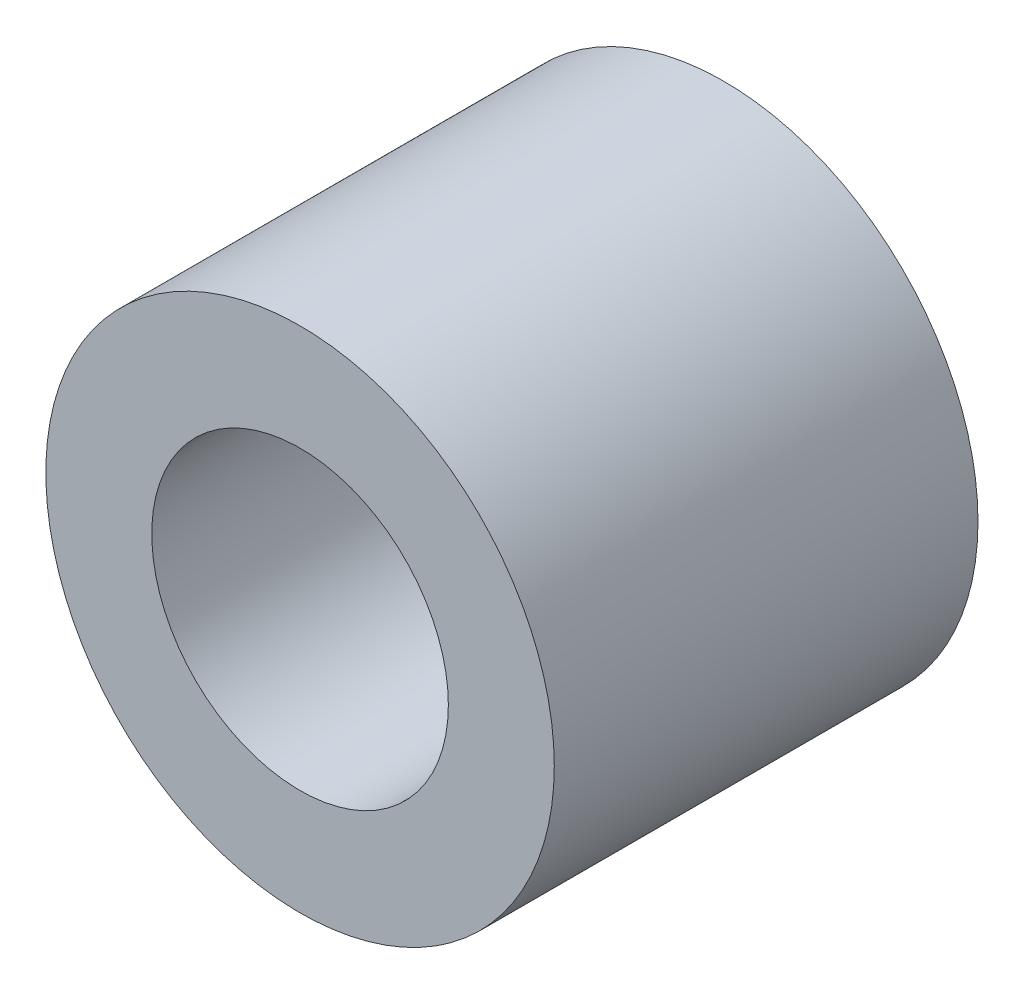
ISO-10303-21;
HEADER;
FILE_DESCRIPTION(('STEP AP214'),'2;1');
FILE_NAME('part.step','',(''),(''),'','','');
FILE_SCHEMA(('AUTOMOTIVE_DESIGN { 1 0 10303 214 1 1 1 1 }'));
ENDSEC;
DATA;
#1=APPLICATION_CONTEXT('core data for automotive mechanical design processes');
#2=APPLICATION_PROTOCOL_DEFINITION('international standard','automotive_design',2000,#1);
#3=PRODUCT_CONTEXT('',#1,'mechanical');
#4=PRODUCT('Part','Part','',(#3));
#5=PRODUCT_RELATED_PRODUCT_CATEGORY('part','',(#4));
#6=PRODUCT_DEFINITION_FORMATION('','',#4);
#7=PRODUCT_DEFINITION_CONTEXT('part definition',#1,'design');
#8=PRODUCT_DEFINITION('design','',#6,#7);
#9=PRODUCT_DEFINITION_SHAPE('','',#8);
#10=(LENGTH_UNIT() NAMED_UNIT(*) SI_UNIT(.MILLI.,.METRE.));
#11=(NAMED_UNIT(*) PLANE_ANGLE_UNIT() SI_UNIT($,.RADIAN.));
#12=(NAMED_UNIT(*) SI_UNIT($,.STERADIAN.) SOLID_ANGLE_UNIT());
#13=UNCERTAINTY_MEASURE_WITH_UNIT(LENGTH_MEASURE(1.E-05),#10,'distance_accuracy_value','');
#14=(GEOMETRIC_REPRESENTATION_CONTEXT(3) GLOBAL_UNCERTAINTY_ASSIGNED_CONTEXT((#13)) GLOBAL_UNIT_ASSIGNED_CONTEXT((#10,
#11,#12)) REPRESENTATION_CONTEXT('',''));
#15=CARTESIAN_POINT('',(0.,0.,0.));
#16=DIRECTION('',(0.,0.,1.));
#17=DIRECTION('',(1.,0.,0.));
#18=AXIS2_PLACEMENT_3D('',#15,#16,#17);
#19=CARTESIAN_POINT('',(0.,0.,10.));
#20=DIRECTION('',(0.,0.,1.));
#21=DIRECTION('',(1.,0.,0.));
#22=AXIS2_PLACEMENT_3D('',#19,#20,#21);
#23=PLANE('',#22);
#24=CARTESIAN_POINT('',(0.,0.,10.));
#25=DIRECTION('',(0.,0.,1.));
#26=DIRECTION('',(1.,0.,0.));
#27=AXIS2_PLACEMENT_3D('',#24,#25,#26);
#28=CIRCLE('',#27,6.);
#29=CARTESIAN_POINT('',(6.,0.,10.));
#30=VERTEX_POINT('',#29);
#31=EDGE_CURVE('E10',#30,#30,#28,.T.);
#32=ORIENTED_EDGE('',*,*,#31,.T.);
#33=EDGE_LOOP('',(#32));
#34=FACE_BOUND('',#33,.T.);
#35=CARTESIAN_POINT('',(0.,0.,10.));
#36=DIRECTION('',(0.,0.,1.));
#37=DIRECTION('',(1.,0.,0.));
#38=AXIS2_PLACEMENT_3D('',#35,#36,#37);
#39=CIRCLE('',#38,3.5);
#40=CARTESIAN_POINT('',(3.5,0.,10.));
#41=VERTEX_POINT('',#40);
#42=EDGE_CURVE('E45',#41,#41,#39,.T.);
#43=ORIENTED_EDGE('',*,*,#42,.F.);
#44=EDGE_LOOP('',(#43));
#45=FACE_BOUND('',#44,.T.);
#46=ADVANCED_FACE('F34',(#34,#45),#23,.T.);
#47=CARTESIAN_POINT('',(0.,0.,0.));
#48=DIRECTION('',(0.,0.,1.));
#49=DIRECTION('',(1.,0.,0.));
#50=AXIS2_PLACEMENT_3D('',#47,#48,#49);
#51=PLANE('',#50);
#52=CARTESIAN_POINT('',(0.,0.,0.));
#53=DIRECTION('',(0.,0.,1.));
#54=DIRECTION('',(1.,0.,0.));
#55=AXIS2_PLACEMENT_3D('',#52,#53,#54);
#56=CIRCLE('',#55,6.);
#57=CARTESIAN_POINT('',(6.,0.,0.));
#58=VERTEX_POINT('',#57);
#59=EDGE_CURVE('E38',#58,#58,#56,.T.);
#60=ORIENTED_EDGE('',*,*,#59,.F.);
#61=EDGE_LOOP('',(#60));
#62=FACE_BOUND('',#61,.T.);
#63=CARTESIAN_POINT('',(0.,0.,0.));
#64=DIRECTION('',(0.,0.,1.));
#65=DIRECTION('',(1.,0.,0.));
#66=AXIS2_PLACEMENT_3D('',#63,#64,#65);
#67=CIRCLE('',#66,3.5);
#68=CARTESIAN_POINT('',(3.5,0.,0.));
#69=VERTEX_POINT('',#68);
#70=EDGE_CURVE('E47',#69,#69,#67,.T.);
#71=ORIENTED_EDGE('',*,*,#70,.T.);
#72=EDGE_LOOP('',(#71));
#73=FACE_BOUND('',#72,.T.);
#74=ADVANCED_FACE('F57',(#62,#73),#51,.F.);
#75=CARTESIAN_POINT('',(0.,0.,10.));
#76=DIRECTION('',(0.,0.,-1.));
#77=DIRECTION('',(-1.,0.,0.));
#78=AXIS2_PLACEMENT_3D('',#75,#76,#77);
#79=CYLINDRICAL_SURFACE('',#78,6.);
#80=ORIENTED_EDGE('',*,*,#31,.F.);
#81=EDGE_LOOP('',(#80));
#82=FACE_BOUND('',#81,.T.);
#83=ORIENTED_EDGE('',*,*,#59,.T.);
#84=EDGE_LOOP('',(#83));
#85=FACE_BOUND('',#84,.T.);
#86=ADVANCED_FACE('F36',(#82,#85),#79,.T.);
#87=CARTESIAN_POINT('',(0.,0.,10.));
#88=DIRECTION('',(0.,0.,-1.));
#89=DIRECTION('',(-1.,0.,0.));
#90=AXIS2_PLACEMENT_3D('',#87,#88,#89);
#91=CYLINDRICAL_SURFACE('',#90,3.5);
#92=ORIENTED_EDGE('',*,*,#42,.T.);
#93=EDGE_LOOP('',(#92));
#94=FACE_BOUND('',#93,.T.);
#95=ORIENTED_EDGE('',*,*,#70,.F.);
#96=EDGE_LOOP('',(#95));
#97=FACE_BOUND('',#96,.T.);
#98=ADVANCED_FACE('F53',(#94,#97),#91,.F.);
#99=CLOSED_SHELL('',(#46,#74,#86,#98));
#100=MANIFOLD_SOLID_BREP('B2',#99);
#101=ADVANCED_BREP_SHAPE_REPRESENTATION('',(#18,#100),#14);
#102=SHAPE_DEFINITION_REPRESENTATION(#9,#101);
ENDSEC;
END-ISO-10303-21;
